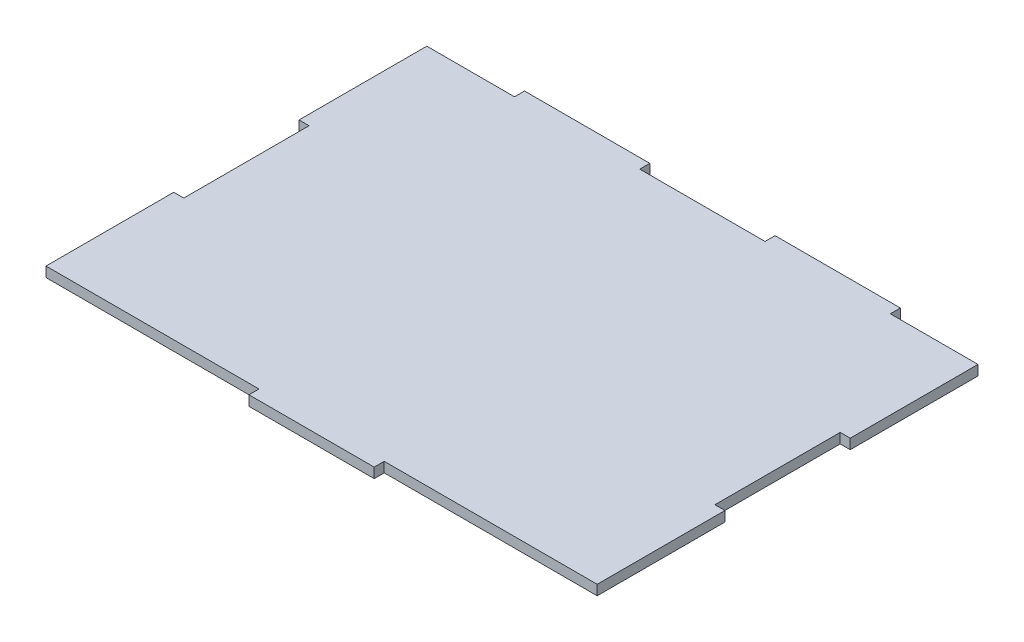
ISO-10303-21;
HEADER;
FILE_DESCRIPTION(('STEP AP214'),'2;1');
FILE_NAME('part.step','',(''),(''),'','','');
FILE_SCHEMA(('AUTOMOTIVE_DESIGN { 1 0 10303 214 1 1 1 1 }'));
ENDSEC;
DATA;
#1=APPLICATION_CONTEXT('core data for automotive mechanical design processes');
#2=APPLICATION_PROTOCOL_DEFINITION('international standard','automotive_design',2000,#1);
#3=PRODUCT_CONTEXT('',#1,'mechanical');
#4=PRODUCT('Part','Part','',(#3));
#5=PRODUCT_RELATED_PRODUCT_CATEGORY('part','',(#4));
#6=PRODUCT_DEFINITION_FORMATION('','',#4);
#7=PRODUCT_DEFINITION_CONTEXT('part definition',#1,'design');
#8=PRODUCT_DEFINITION('design','',#6,#7);
#9=PRODUCT_DEFINITION_SHAPE('','',#8);
#10=(LENGTH_UNIT() NAMED_UNIT(*) SI_UNIT(.MILLI.,.METRE.));
#11=(NAMED_UNIT(*) PLANE_ANGLE_UNIT() SI_UNIT($,.RADIAN.));
#12=(NAMED_UNIT(*) SI_UNIT($,.STERADIAN.) SOLID_ANGLE_UNIT());
#13=UNCERTAINTY_MEASURE_WITH_UNIT(LENGTH_MEASURE(1.E-05),#10,'distance_accuracy_value','');
#14=(GEOMETRIC_REPRESENTATION_CONTEXT(3) GLOBAL_UNCERTAINTY_ASSIGNED_CONTEXT((#13)) GLOBAL_UNIT_ASSIGNED_CONTEXT((#10,
#11,#12)) REPRESENTATION_CONTEXT('',''));
#15=CARTESIAN_POINT('',(0.,0.,0.));
#16=DIRECTION('',(0.,0.,1.));
#17=DIRECTION('',(1.,0.,0.));
#18=AXIS2_PLACEMENT_3D('',#15,#16,#17);
#19=CARTESIAN_POINT('',(-110.,4.,-76.));
#20=DIRECTION('',(0.,0.,1.));
#21=DIRECTION('',(1.,0.,0.));
#22=AXIS2_PLACEMENT_3D('',#19,#20,#21);
#23=PLANE('',#22);
#24=DIRECTION('',(-1.,0.,0.));
#25=VECTOR('',#24,1.);
#26=CARTESIAN_POINT('',(-110.,0.,-76.));
#27=LINE('',#26,#25);
#28=CARTESIAN_POINT('',(-75.,0.,-76.));
#29=VERTEX_POINT('',#28);
#30=CARTESIAN_POINT('',(-110.,0.,-76.));
#31=VERTEX_POINT('',#30);
#32=EDGE_CURVE('E242',#29,#31,#27,.T.);
#33=ORIENTED_EDGE('',*,*,#32,.T.);
#34=DIRECTION('',(0.,-1.,0.));
#35=VECTOR('',#34,1.);
#36=CARTESIAN_POINT('',(-110.,4.,-76.));
#37=LINE('',#36,#35);
#38=CARTESIAN_POINT('',(-110.,4.,-76.));
#39=VERTEX_POINT('',#38);
#40=EDGE_CURVE('E11',#39,#31,#37,.T.);
#41=ORIENTED_EDGE('',*,*,#40,.F.);
#42=DIRECTION('',(-1.,0.,0.));
#43=VECTOR('',#42,1.);
#44=CARTESIAN_POINT('',(-110.,4.,-76.));
#45=LINE('',#44,#43);
#46=CARTESIAN_POINT('',(-75.,4.,-76.));
#47=VERTEX_POINT('',#46);
#48=EDGE_CURVE('E312',#47,#39,#45,.T.);
#49=ORIENTED_EDGE('',*,*,#48,.F.);
#50=DIRECTION('',(0.,-1.,0.));
#51=VECTOR('',#50,1.);
#52=CARTESIAN_POINT('',(-75.,4.,-76.));
#53=LINE('',#52,#51);
#54=EDGE_CURVE('E238',#47,#29,#53,.T.);
#55=ORIENTED_EDGE('',*,*,#54,.T.);
#56=EDGE_LOOP('',(#33,#41,#49,#55));
#57=FACE_BOUND('',#56,.T.);
#58=ADVANCED_FACE('F45',(#57),#23,.F.);
#59=CARTESIAN_POINT('',(-110.,4.,-76.));
#60=DIRECTION('',(1.,0.,0.));
#61=DIRECTION('',(0.,0.,-1.));
#62=AXIS2_PLACEMENT_3D('',#59,#60,#61);
#63=PLANE('',#62);
#64=DIRECTION('',(0.,0.,1.));
#65=VECTOR('',#64,1.);
#66=CARTESIAN_POINT('',(-110.,0.,-76.));
#67=LINE('',#66,#65);
#68=CARTESIAN_POINT('',(-110.,0.,-25.));
#69=VERTEX_POINT('',#68);
#70=EDGE_CURVE('E246',#31,#69,#67,.T.);
#71=ORIENTED_EDGE('',*,*,#70,.T.);
#72=DIRECTION('',(0.,-1.,0.));
#73=VECTOR('',#72,1.);
#74=CARTESIAN_POINT('',(-110.,4.,-25.));
#75=LINE('',#74,#73);
#76=CARTESIAN_POINT('',(-110.,4.,-25.));
#77=VERTEX_POINT('',#76);
#78=EDGE_CURVE('E54',#77,#69,#75,.T.);
#79=ORIENTED_EDGE('',*,*,#78,.F.);
#80=DIRECTION('',(0.,0.,1.));
#81=VECTOR('',#80,1.);
#82=CARTESIAN_POINT('',(-110.,4.,-76.));
#83=LINE('',#82,#81);
#84=EDGE_CURVE('E153',#39,#77,#83,.T.);
#85=ORIENTED_EDGE('',*,*,#84,.F.);
#86=ORIENTED_EDGE('',*,*,#40,.T.);
#87=EDGE_LOOP('',(#71,#79,#85,#86));
#88=FACE_BOUND('',#87,.T.);
#89=ADVANCED_FACE('F490',(#88),#63,.F.);
#90=CARTESIAN_POINT('',(-106.,4.,-25.));
#91=DIRECTION('',(0.,0.,-1.));
#92=DIRECTION('',(-1.,0.,0.));
#93=AXIS2_PLACEMENT_3D('',#90,#91,#92);
#94=PLANE('',#93);
#95=DIRECTION('',(1.,0.,0.));
#96=VECTOR('',#95,1.);
#97=CARTESIAN_POINT('',(-106.,0.,-25.));
#98=LINE('',#97,#96);
#99=CARTESIAN_POINT('',(-106.,0.,-25.));
#100=VERTEX_POINT('',#99);
#101=EDGE_CURVE('E249',#69,#100,#98,.T.);
#102=ORIENTED_EDGE('',*,*,#101,.T.);
#103=DIRECTION('',(0.,-1.,0.));
#104=VECTOR('',#103,1.);
#105=CARTESIAN_POINT('',(-106.,4.,-25.));
#106=LINE('',#105,#104);
#107=CARTESIAN_POINT('',(-106.,4.,-25.));
#108=VERTEX_POINT('',#107);
#109=EDGE_CURVE('E387',#108,#100,#106,.T.);
#110=ORIENTED_EDGE('',*,*,#109,.F.);
#111=DIRECTION('',(1.,0.,0.));
#112=VECTOR('',#111,1.);
#113=CARTESIAN_POINT('',(-106.,4.,-25.));
#114=LINE('',#113,#112);
#115=EDGE_CURVE('E397',#77,#108,#114,.T.);
#116=ORIENTED_EDGE('',*,*,#115,.F.);
#117=ORIENTED_EDGE('',*,*,#78,.T.);
#118=EDGE_LOOP('',(#102,#110,#116,#117));
#119=FACE_BOUND('',#118,.T.);
#120=ADVANCED_FACE('F395',(#119),#94,.F.);
#121=CARTESIAN_POINT('',(-106.,4.,25.));
#122=DIRECTION('',(1.,0.,0.));
#123=DIRECTION('',(0.,0.,-1.));
#124=AXIS2_PLACEMENT_3D('',#121,#122,#123);
#125=PLANE('',#124);
#126=DIRECTION('',(0.,0.,1.));
#127=VECTOR('',#126,1.);
#128=CARTESIAN_POINT('',(-106.,0.,25.));
#129=LINE('',#128,#127);
#130=CARTESIAN_POINT('',(-106.,0.,25.));
#131=VERTEX_POINT('',#130);
#132=EDGE_CURVE('E252',#100,#131,#129,.T.);
#133=ORIENTED_EDGE('',*,*,#132,.T.);
#134=DIRECTION('',(0.,-1.,0.));
#135=VECTOR('',#134,1.);
#136=CARTESIAN_POINT('',(-106.,4.,25.));
#137=LINE('',#136,#135);
#138=CARTESIAN_POINT('',(-106.,4.,25.));
#139=VERTEX_POINT('',#138);
#140=EDGE_CURVE('E383',#139,#131,#137,.T.);
#141=ORIENTED_EDGE('',*,*,#140,.F.);
#142=DIRECTION('',(0.,0.,1.));
#143=VECTOR('',#142,1.);
#144=CARTESIAN_POINT('',(-106.,4.,25.));
#145=LINE('',#144,#143);
#146=EDGE_CURVE('E416',#108,#139,#145,.T.);
#147=ORIENTED_EDGE('',*,*,#146,.F.);
#148=ORIENTED_EDGE('',*,*,#109,.T.);
#149=EDGE_LOOP('',(#133,#141,#147,#148));
#150=FACE_BOUND('',#149,.T.);
#151=ADVANCED_FACE('F406',(#150),#125,.F.);
#152=CARTESIAN_POINT('',(-106.,4.,25.));
#153=DIRECTION('',(0.,0.,1.));
#154=DIRECTION('',(1.,0.,0.));
#155=AXIS2_PLACEMENT_3D('',#152,#153,#154);
#156=PLANE('',#155);
#157=DIRECTION('',(-1.,0.,0.));
#158=VECTOR('',#157,1.);
#159=CARTESIAN_POINT('',(-106.,0.,25.));
#160=LINE('',#159,#158);
#161=CARTESIAN_POINT('',(-110.,0.,25.));
#162=VERTEX_POINT('',#161);
#163=EDGE_CURVE('E255',#131,#162,#160,.T.);
#164=ORIENTED_EDGE('',*,*,#163,.T.);
#165=DIRECTION('',(0.,-1.,0.));
#166=VECTOR('',#165,1.);
#167=CARTESIAN_POINT('',(-110.,4.,25.));
#168=LINE('',#167,#166);
#169=CARTESIAN_POINT('',(-110.,4.,25.));
#170=VERTEX_POINT('',#169);
#171=EDGE_CURVE('E379',#170,#162,#168,.T.);
#172=ORIENTED_EDGE('',*,*,#171,.F.);
#173=DIRECTION('',(-1.,0.,0.));
#174=VECTOR('',#173,1.);
#175=CARTESIAN_POINT('',(-106.,4.,25.));
#176=LINE('',#175,#174);
#177=EDGE_CURVE('E412',#139,#170,#176,.T.);
#178=ORIENTED_EDGE('',*,*,#177,.F.);
#179=ORIENTED_EDGE('',*,*,#140,.T.);
#180=EDGE_LOOP('',(#164,#172,#178,#179));
#181=FACE_BOUND('',#180,.T.);
#182=ADVANCED_FACE('F410',(#181),#156,.F.);
#183=CARTESIAN_POINT('',(-110.,4.,25.));
#184=DIRECTION('',(1.,0.,0.));
#185=DIRECTION('',(0.,0.,-1.));
#186=AXIS2_PLACEMENT_3D('',#183,#184,#185);
#187=PLANE('',#186);
#188=DIRECTION('',(0.,0.,1.));
#189=VECTOR('',#188,1.);
#190=CARTESIAN_POINT('',(-110.,0.,25.));
#191=LINE('',#190,#189);
#192=CARTESIAN_POINT('',(-110.,0.,76.));
#193=VERTEX_POINT('',#192);
#194=EDGE_CURVE('E258',#162,#193,#191,.T.);
#195=ORIENTED_EDGE('',*,*,#194,.T.);
#196=DIRECTION('',(0.,-1.,0.));
#197=VECTOR('',#196,1.);
#198=CARTESIAN_POINT('',(-110.,4.,76.));
#199=LINE('',#198,#197);
#200=CARTESIAN_POINT('',(-110.,4.,76.));
#201=VERTEX_POINT('',#200);
#202=EDGE_CURVE('E375',#201,#193,#199,.T.);
#203=ORIENTED_EDGE('',*,*,#202,.F.);
#204=DIRECTION('',(0.,0.,1.));
#205=VECTOR('',#204,1.);
#206=CARTESIAN_POINT('',(-110.,4.,25.));
#207=LINE('',#206,#205);
#208=EDGE_CURVE('E415',#170,#201,#207,.T.);
#209=ORIENTED_EDGE('',*,*,#208,.F.);
#210=ORIENTED_EDGE('',*,*,#171,.T.);
#211=EDGE_LOOP('',(#195,#203,#209,#210));
#212=FACE_BOUND('',#211,.T.);
#213=ADVANCED_FACE('F503',(#212),#187,.F.);
#214=CARTESIAN_POINT('',(-110.,4.,76.));
#215=DIRECTION('',(0.,0.,-1.));
#216=DIRECTION('',(-1.,0.,0.));
#217=AXIS2_PLACEMENT_3D('',#214,#215,#216);
#218=PLANE('',#217);
#219=DIRECTION('',(1.,0.,0.));
#220=VECTOR('',#219,1.);
#221=CARTESIAN_POINT('',(-110.,0.,76.));
#222=LINE('',#221,#220);
#223=CARTESIAN_POINT('',(-25.,0.,76.));
#224=VERTEX_POINT('',#223);
#225=EDGE_CURVE('E261',#193,#224,#222,.T.);
#226=ORIENTED_EDGE('',*,*,#225,.T.);
#227=DIRECTION('',(0.,-1.,0.));
#228=VECTOR('',#227,1.);
#229=CARTESIAN_POINT('',(-25.,4.,76.));
#230=LINE('',#229,#228);
#231=CARTESIAN_POINT('',(-25.,4.,76.));
#232=VERTEX_POINT('',#231);
#233=EDGE_CURVE('E371',#232,#224,#230,.T.);
#234=ORIENTED_EDGE('',*,*,#233,.F.);
#235=DIRECTION('',(1.,0.,0.));
#236=VECTOR('',#235,1.);
#237=CARTESIAN_POINT('',(-110.,4.,76.));
#238=LINE('',#237,#236);
#239=EDGE_CURVE('E420',#201,#232,#238,.T.);
#240=ORIENTED_EDGE('',*,*,#239,.F.);
#241=ORIENTED_EDGE('',*,*,#202,.T.);
#242=EDGE_LOOP('',(#226,#234,#240,#241));
#243=FACE_BOUND('',#242,.T.);
#244=ADVANCED_FACE('F506',(#243),#218,.F.);
#245=CARTESIAN_POINT('',(-25.,4.,76.));
#246=DIRECTION('',(1.,0.,0.));
#247=DIRECTION('',(0.,0.,-1.));
#248=AXIS2_PLACEMENT_3D('',#245,#246,#247);
#249=PLANE('',#248);
#250=DIRECTION('',(0.,0.,1.));
#251=VECTOR('',#250,1.);
#252=CARTESIAN_POINT('',(-25.,0.,76.));
#253=LINE('',#252,#251);
#254=CARTESIAN_POINT('',(-25.,0.,80.));
#255=VERTEX_POINT('',#254);
#256=EDGE_CURVE('E264',#224,#255,#253,.T.);
#257=ORIENTED_EDGE('',*,*,#256,.T.);
#258=DIRECTION('',(0.,-1.,0.));
#259=VECTOR('',#258,1.);
#260=CARTESIAN_POINT('',(-25.,4.,80.));
#261=LINE('',#260,#259);
#262=CARTESIAN_POINT('',(-25.,4.,80.));
#263=VERTEX_POINT('',#262);
#264=EDGE_CURVE('E367',#263,#255,#261,.T.);
#265=ORIENTED_EDGE('',*,*,#264,.F.);
#266=DIRECTION('',(0.,0.,1.));
#267=VECTOR('',#266,1.);
#268=CARTESIAN_POINT('',(-25.,4.,76.));
#269=LINE('',#268,#267);
#270=EDGE_CURVE('E427',#232,#263,#269,.T.);
#271=ORIENTED_EDGE('',*,*,#270,.F.);
#272=ORIENTED_EDGE('',*,*,#233,.T.);
#273=EDGE_LOOP('',(#257,#265,#271,#272));
#274=FACE_BOUND('',#273,.T.);
#275=ADVANCED_FACE('F510',(#274),#249,.F.);
#276=CARTESIAN_POINT('',(-25.,4.,80.));
#277=DIRECTION('',(0.,0.,-1.));
#278=DIRECTION('',(-1.,0.,0.));
#279=AXIS2_PLACEMENT_3D('',#276,#277,#278);
#280=PLANE('',#279);
#281=DIRECTION('',(1.,0.,0.));
#282=VECTOR('',#281,1.);
#283=CARTESIAN_POINT('',(-25.,0.,80.));
#284=LINE('',#283,#282);
#285=CARTESIAN_POINT('',(25.,0.,80.));
#286=VERTEX_POINT('',#285);
#287=EDGE_CURVE('E267',#255,#286,#284,.T.);
#288=ORIENTED_EDGE('',*,*,#287,.T.);
#289=DIRECTION('',(0.,-1.,0.));
#290=VECTOR('',#289,1.);
#291=CARTESIAN_POINT('',(25.,4.,80.));
#292=LINE('',#291,#290);
#293=CARTESIAN_POINT('',(25.,4.,80.));
#294=VERTEX_POINT('',#293);
#295=EDGE_CURVE('E363',#294,#286,#292,.T.);
#296=ORIENTED_EDGE('',*,*,#295,.F.);
#297=DIRECTION('',(1.,0.,0.));
#298=VECTOR('',#297,1.);
#299=CARTESIAN_POINT('',(-25.,4.,80.));
#300=LINE('',#299,#298);
#301=EDGE_CURVE('E430',#263,#294,#300,.T.);
#302=ORIENTED_EDGE('',*,*,#301,.F.);
#303=ORIENTED_EDGE('',*,*,#264,.T.);
#304=EDGE_LOOP('',(#288,#296,#302,#303));
#305=FACE_BOUND('',#304,.T.);
#306=ADVANCED_FACE('F514',(#305),#280,.F.);
#307=CARTESIAN_POINT('',(25.,4.,76.));
#308=DIRECTION('',(-1.,0.,0.));
#309=DIRECTION('',(0.,0.,1.));
#310=AXIS2_PLACEMENT_3D('',#307,#308,#309);
#311=PLANE('',#310);
#312=DIRECTION('',(0.,0.,-1.));
#313=VECTOR('',#312,1.);
#314=CARTESIAN_POINT('',(25.,0.,76.));
#315=LINE('',#314,#313);
#316=CARTESIAN_POINT('',(25.,0.,76.));
#317=VERTEX_POINT('',#316);
#318=EDGE_CURVE('E270',#286,#317,#315,.T.);
#319=ORIENTED_EDGE('',*,*,#318,.T.);
#320=DIRECTION('',(0.,-1.,0.));
#321=VECTOR('',#320,1.);
#322=CARTESIAN_POINT('',(25.,4.,76.));
#323=LINE('',#322,#321);
#324=CARTESIAN_POINT('',(25.,4.,76.));
#325=VERTEX_POINT('',#324);
#326=EDGE_CURVE('E359',#325,#317,#323,.T.);
#327=ORIENTED_EDGE('',*,*,#326,.F.);
#328=DIRECTION('',(0.,0.,-1.));
#329=VECTOR('',#328,1.);
#330=CARTESIAN_POINT('',(25.,4.,76.));
#331=LINE('',#330,#329);
#332=EDGE_CURVE('E433',#294,#325,#331,.T.);
#333=ORIENTED_EDGE('',*,*,#332,.F.);
#334=ORIENTED_EDGE('',*,*,#295,.T.);
#335=EDGE_LOOP('',(#319,#327,#333,#334));
#336=FACE_BOUND('',#335,.T.);
#337=ADVANCED_FACE('F518',(#336),#311,.F.);
#338=CARTESIAN_POINT('',(25.,4.,76.));
#339=DIRECTION('',(0.,0.,-1.));
#340=DIRECTION('',(-1.,0.,0.));
#341=AXIS2_PLACEMENT_3D('',#338,#339,#340);
#342=PLANE('',#341);
#343=DIRECTION('',(1.,0.,0.));
#344=VECTOR('',#343,1.);
#345=CARTESIAN_POINT('',(25.,0.,76.));
#346=LINE('',#345,#344);
#347=CARTESIAN_POINT('',(110.,0.,76.));
#348=VERTEX_POINT('',#347);
#349=EDGE_CURVE('E273',#317,#348,#346,.T.);
#350=ORIENTED_EDGE('',*,*,#349,.T.);
#351=DIRECTION('',(0.,-1.,0.));
#352=VECTOR('',#351,1.);
#353=CARTESIAN_POINT('',(110.,4.,76.));
#354=LINE('',#353,#352);
#355=CARTESIAN_POINT('',(110.,4.,76.));
#356=VERTEX_POINT('',#355);
#357=EDGE_CURVE('E355',#356,#348,#354,.T.);
#358=ORIENTED_EDGE('',*,*,#357,.F.);
#359=DIRECTION('',(1.,0.,0.));
#360=VECTOR('',#359,1.);
#361=CARTESIAN_POINT('',(25.,4.,76.));
#362=LINE('',#361,#360);
#363=EDGE_CURVE('E436',#325,#356,#362,.T.);
#364=ORIENTED_EDGE('',*,*,#363,.F.);
#365=ORIENTED_EDGE('',*,*,#326,.T.);
#366=EDGE_LOOP('',(#350,#358,#364,#365));
#367=FACE_BOUND('',#366,.T.);
#368=ADVANCED_FACE('F522',(#367),#342,.F.);
#369=CARTESIAN_POINT('',(110.,4.,76.));
#370=DIRECTION('',(-1.,0.,0.));
#371=DIRECTION('',(0.,0.,1.));
#372=AXIS2_PLACEMENT_3D('',#369,#370,#371);
#373=PLANE('',#372);
#374=DIRECTION('',(0.,0.,-1.));
#375=VECTOR('',#374,1.);
#376=CARTESIAN_POINT('',(110.,0.,76.));
#377=LINE('',#376,#375);
#378=CARTESIAN_POINT('',(110.,0.,25.));
#379=VERTEX_POINT('',#378);
#380=EDGE_CURVE('E276',#348,#379,#377,.T.);
#381=ORIENTED_EDGE('',*,*,#380,.T.);
#382=DIRECTION('',(0.,-1.,0.));
#383=VECTOR('',#382,1.);
#384=CARTESIAN_POINT('',(110.,4.,25.));
#385=LINE('',#384,#383);
#386=CARTESIAN_POINT('',(110.,4.,25.));
#387=VERTEX_POINT('',#386);
#388=EDGE_CURVE('E351',#387,#379,#385,.T.);
#389=ORIENTED_EDGE('',*,*,#388,.F.);
#390=DIRECTION('',(0.,0.,-1.));
#391=VECTOR('',#390,1.);
#392=CARTESIAN_POINT('',(110.,4.,76.));
#393=LINE('',#392,#391);
#394=EDGE_CURVE('E439',#356,#387,#393,.T.);
#395=ORIENTED_EDGE('',*,*,#394,.F.);
#396=ORIENTED_EDGE('',*,*,#357,.T.);
#397=EDGE_LOOP('',(#381,#389,#395,#396));
#398=FACE_BOUND('',#397,.T.);
#399=ADVANCED_FACE('F526',(#398),#373,.F.);
#400=CARTESIAN_POINT('',(106.,4.,25.));
#401=DIRECTION('',(0.,0.,1.));
#402=DIRECTION('',(1.,0.,0.));
#403=AXIS2_PLACEMENT_3D('',#400,#401,#402);
#404=PLANE('',#403);
#405=DIRECTION('',(-1.,0.,0.));
#406=VECTOR('',#405,1.);
#407=CARTESIAN_POINT('',(106.,0.,25.));
#408=LINE('',#407,#406);
#409=CARTESIAN_POINT('',(106.,0.,25.));
#410=VERTEX_POINT('',#409);
#411=EDGE_CURVE('E279',#379,#410,#408,.T.);
#412=ORIENTED_EDGE('',*,*,#411,.T.);
#413=DIRECTION('',(0.,-1.,0.));
#414=VECTOR('',#413,1.);
#415=CARTESIAN_POINT('',(106.,4.,25.));
#416=LINE('',#415,#414);
#417=CARTESIAN_POINT('',(106.,4.,25.));
#418=VERTEX_POINT('',#417);
#419=EDGE_CURVE('E347',#418,#410,#416,.T.);
#420=ORIENTED_EDGE('',*,*,#419,.F.);
#421=DIRECTION('',(-1.,0.,0.));
#422=VECTOR('',#421,1.);
#423=CARTESIAN_POINT('',(106.,4.,25.));
#424=LINE('',#423,#422);
#425=EDGE_CURVE('E442',#387,#418,#424,.T.);
#426=ORIENTED_EDGE('',*,*,#425,.F.);
#427=ORIENTED_EDGE('',*,*,#388,.T.);
#428=EDGE_LOOP('',(#412,#420,#426,#427));
#429=FACE_BOUND('',#428,.T.);
#430=ADVANCED_FACE('F530',(#429),#404,.F.);
#431=CARTESIAN_POINT('',(106.,4.,25.));
#432=DIRECTION('',(-1.,0.,0.));
#433=DIRECTION('',(0.,0.,1.));
#434=AXIS2_PLACEMENT_3D('',#431,#432,#433);
#435=PLANE('',#434);
#436=DIRECTION('',(0.,0.,-1.));
#437=VECTOR('',#436,1.);
#438=CARTESIAN_POINT('',(106.,0.,25.));
#439=LINE('',#438,#437);
#440=CARTESIAN_POINT('',(106.,0.,-25.));
#441=VERTEX_POINT('',#440);
#442=EDGE_CURVE('E282',#410,#441,#439,.T.);
#443=ORIENTED_EDGE('',*,*,#442,.T.);
#444=DIRECTION('',(0.,-1.,0.));
#445=VECTOR('',#444,1.);
#446=CARTESIAN_POINT('',(106.,4.,-25.));
#447=LINE('',#446,#445);
#448=CARTESIAN_POINT('',(106.,4.,-25.));
#449=VERTEX_POINT('',#448);
#450=EDGE_CURVE('E343',#449,#441,#447,.T.);
#451=ORIENTED_EDGE('',*,*,#450,.F.);
#452=DIRECTION('',(0.,0.,-1.));
#453=VECTOR('',#452,1.);
#454=CARTESIAN_POINT('',(106.,4.,25.));
#455=LINE('',#454,#453);
#456=EDGE_CURVE('E445',#418,#449,#455,.T.);
#457=ORIENTED_EDGE('',*,*,#456,.F.);
#458=ORIENTED_EDGE('',*,*,#419,.T.);
#459=EDGE_LOOP('',(#443,#451,#457,#458));
#460=FACE_BOUND('',#459,.T.);
#461=ADVANCED_FACE('F534',(#460),#435,.F.);
#462=CARTESIAN_POINT('',(106.,4.,-25.));
#463=DIRECTION('',(0.,0.,-1.));
#464=DIRECTION('',(-1.,0.,0.));
#465=AXIS2_PLACEMENT_3D('',#462,#463,#464);
#466=PLANE('',#465);
#467=DIRECTION('',(1.,0.,0.));
#468=VECTOR('',#467,1.);
#469=CARTESIAN_POINT('',(106.,0.,-25.));
#470=LINE('',#469,#468);
#471=CARTESIAN_POINT('',(110.,0.,-25.));
#472=VERTEX_POINT('',#471);
#473=EDGE_CURVE('E285',#441,#472,#470,.T.);
#474=ORIENTED_EDGE('',*,*,#473,.T.);
#475=DIRECTION('',(0.,-1.,0.));
#476=VECTOR('',#475,1.);
#477=CARTESIAN_POINT('',(110.,4.,-25.));
#478=LINE('',#477,#476);
#479=CARTESIAN_POINT('',(110.,4.,-25.));
#480=VERTEX_POINT('',#479);
#481=EDGE_CURVE('E339',#480,#472,#478,.T.);
#482=ORIENTED_EDGE('',*,*,#481,.F.);
#483=DIRECTION('',(1.,0.,0.));
#484=VECTOR('',#483,1.);
#485=CARTESIAN_POINT('',(106.,4.,-25.));
#486=LINE('',#485,#484);
#487=EDGE_CURVE('E448',#449,#480,#486,.T.);
#488=ORIENTED_EDGE('',*,*,#487,.F.);
#489=ORIENTED_EDGE('',*,*,#450,.T.);
#490=EDGE_LOOP('',(#474,#482,#488,#489));
#491=FACE_BOUND('',#490,.T.);
#492=ADVANCED_FACE('F538',(#491),#466,.F.);
#493=CARTESIAN_POINT('',(110.,4.,-25.));
#494=DIRECTION('',(-1.,0.,0.));
#495=DIRECTION('',(0.,0.,1.));
#496=AXIS2_PLACEMENT_3D('',#493,#494,#495);
#497=PLANE('',#496);
#498=DIRECTION('',(0.,0.,-1.));
#499=VECTOR('',#498,1.);
#500=CARTESIAN_POINT('',(110.,0.,-25.));
#501=LINE('',#500,#499);
#502=CARTESIAN_POINT('',(110.,0.,-76.));
#503=VERTEX_POINT('',#502);
#504=EDGE_CURVE('E288',#472,#503,#501,.T.);
#505=ORIENTED_EDGE('',*,*,#504,.T.);
#506=DIRECTION('',(0.,-1.,0.));
#507=VECTOR('',#506,1.);
#508=CARTESIAN_POINT('',(110.,4.,-76.));
#509=LINE('',#508,#507);
#510=CARTESIAN_POINT('',(110.,4.,-76.));
#511=VERTEX_POINT('',#510);
#512=EDGE_CURVE('E335',#511,#503,#509,.T.);
#513=ORIENTED_EDGE('',*,*,#512,.F.);
#514=DIRECTION('',(0.,0.,-1.));
#515=VECTOR('',#514,1.);
#516=CARTESIAN_POINT('',(110.,4.,-25.));
#517=LINE('',#516,#515);
#518=EDGE_CURVE('E451',#480,#511,#517,.T.);
#519=ORIENTED_EDGE('',*,*,#518,.F.);
#520=ORIENTED_EDGE('',*,*,#481,.T.);
#521=EDGE_LOOP('',(#505,#513,#519,#520));
#522=FACE_BOUND('',#521,.T.);
#523=ADVANCED_FACE('F542',(#522),#497,.F.);
#524=CARTESIAN_POINT('',(75.,4.,-76.));
#525=DIRECTION('',(0.,0.,1.));
#526=DIRECTION('',(1.,0.,0.));
#527=AXIS2_PLACEMENT_3D('',#524,#525,#526);
#528=PLANE('',#527);
#529=DIRECTION('',(-1.,0.,0.));
#530=VECTOR('',#529,1.);
#531=CARTESIAN_POINT('',(75.,0.,-76.));
#532=LINE('',#531,#530);
#533=CARTESIAN_POINT('',(75.,0.,-76.));
#534=VERTEX_POINT('',#533);
#535=EDGE_CURVE('E291',#503,#534,#532,.T.);
#536=ORIENTED_EDGE('',*,*,#535,.T.);
#537=DIRECTION('',(0.,-1.,0.));
#538=VECTOR('',#537,1.);
#539=CARTESIAN_POINT('',(75.,4.,-76.));
#540=LINE('',#539,#538);
#541=CARTESIAN_POINT('',(75.,4.,-76.));
#542=VERTEX_POINT('',#541);
#543=EDGE_CURVE('E331',#542,#534,#540,.T.);
#544=ORIENTED_EDGE('',*,*,#543,.F.);
#545=DIRECTION('',(-1.,0.,0.));
#546=VECTOR('',#545,1.);
#547=CARTESIAN_POINT('',(75.,4.,-76.));
#548=LINE('',#547,#546);
#549=EDGE_CURVE('E454',#511,#542,#548,.T.);
#550=ORIENTED_EDGE('',*,*,#549,.F.);
#551=ORIENTED_EDGE('',*,*,#512,.T.);
#552=EDGE_LOOP('',(#536,#544,#550,#551));
#553=FACE_BOUND('',#552,.T.);
#554=ADVANCED_FACE('F546',(#553),#528,.F.);
#555=CARTESIAN_POINT('',(75.,4.,-80.));
#556=DIRECTION('',(-1.,0.,0.));
#557=DIRECTION('',(0.,0.,1.));
#558=AXIS2_PLACEMENT_3D('',#555,#556,#557);
#559=PLANE('',#558);
#560=DIRECTION('',(0.,0.,-1.));
#561=VECTOR('',#560,1.);
#562=CARTESIAN_POINT('',(75.,0.,-80.));
#563=LINE('',#562,#561);
#564=CARTESIAN_POINT('',(75.,0.,-80.));
#565=VERTEX_POINT('',#564);
#566=EDGE_CURVE('E294',#534,#565,#563,.T.);
#567=ORIENTED_EDGE('',*,*,#566,.T.);
#568=DIRECTION('',(0.,-1.,0.));
#569=VECTOR('',#568,1.);
#570=CARTESIAN_POINT('',(75.,4.,-80.));
#571=LINE('',#570,#569);
#572=CARTESIAN_POINT('',(75.,4.,-80.));
#573=VERTEX_POINT('',#572);
#574=EDGE_CURVE('E327',#573,#565,#571,.T.);
#575=ORIENTED_EDGE('',*,*,#574,.F.);
#576=DIRECTION('',(0.,0.,-1.));
#577=VECTOR('',#576,1.);
#578=CARTESIAN_POINT('',(75.,4.,-80.));
#579=LINE('',#578,#577);
#580=EDGE_CURVE('E457',#542,#573,#579,.T.);
#581=ORIENTED_EDGE('',*,*,#580,.F.);
#582=ORIENTED_EDGE('',*,*,#543,.T.);
#583=EDGE_LOOP('',(#567,#575,#581,#582));
#584=FACE_BOUND('',#583,.T.);
#585=ADVANCED_FACE('F550',(#584),#559,.F.);
#586=CARTESIAN_POINT('',(75.,4.,-80.));
#587=DIRECTION('',(0.,0.,1.));
#588=DIRECTION('',(1.,0.,0.));
#589=AXIS2_PLACEMENT_3D('',#586,#587,#588);
#590=PLANE('',#589);
#591=DIRECTION('',(-1.,0.,0.));
#592=VECTOR('',#591,1.);
#593=CARTESIAN_POINT('',(75.,0.,-80.));
#594=LINE('',#593,#592);
#595=CARTESIAN_POINT('',(25.,0.,-80.));
#596=VERTEX_POINT('',#595);
#597=EDGE_CURVE('E297',#565,#596,#594,.T.);
#598=ORIENTED_EDGE('',*,*,#597,.T.);
#599=DIRECTION('',(0.,-1.,0.));
#600=VECTOR('',#599,1.);
#601=CARTESIAN_POINT('',(25.,4.,-80.));
#602=LINE('',#601,#600);
#603=CARTESIAN_POINT('',(25.,4.,-80.));
#604=VERTEX_POINT('',#603);
#605=EDGE_CURVE('E323',#604,#596,#602,.T.);
#606=ORIENTED_EDGE('',*,*,#605,.F.);
#607=DIRECTION('',(-1.,0.,0.));
#608=VECTOR('',#607,1.);
#609=CARTESIAN_POINT('',(75.,4.,-80.));
#610=LINE('',#609,#608);
#611=EDGE_CURVE('E460',#573,#604,#610,.T.);
#612=ORIENTED_EDGE('',*,*,#611,.F.);
#613=ORIENTED_EDGE('',*,*,#574,.T.);
#614=EDGE_LOOP('',(#598,#606,#612,#613));
#615=FACE_BOUND('',#614,.T.);
#616=ADVANCED_FACE('F554',(#615),#590,.F.);
#617=CARTESIAN_POINT('',(25.,4.,-80.));
#618=DIRECTION('',(1.,0.,0.));
#619=DIRECTION('',(0.,0.,-1.));
#620=AXIS2_PLACEMENT_3D('',#617,#618,#619);
#621=PLANE('',#620);
#622=DIRECTION('',(0.,0.,1.));
#623=VECTOR('',#622,1.);
#624=CARTESIAN_POINT('',(25.,0.,-80.));
#625=LINE('',#624,#623);
#626=CARTESIAN_POINT('',(25.,0.,-76.));
#627=VERTEX_POINT('',#626);
#628=EDGE_CURVE('E300',#596,#627,#625,.T.);
#629=ORIENTED_EDGE('',*,*,#628,.T.);
#630=DIRECTION('',(0.,-1.,0.));
#631=VECTOR('',#630,1.);
#632=CARTESIAN_POINT('',(25.,4.,-76.));
#633=LINE('',#632,#631);
#634=CARTESIAN_POINT('',(25.,4.,-76.));
#635=VERTEX_POINT('',#634);
#636=EDGE_CURVE('E319',#635,#627,#633,.T.);
#637=ORIENTED_EDGE('',*,*,#636,.F.);
#638=DIRECTION('',(0.,0.,1.));
#639=VECTOR('',#638,1.);
#640=CARTESIAN_POINT('',(25.,4.,-80.));
#641=LINE('',#640,#639);
#642=EDGE_CURVE('E463',#604,#635,#641,.T.);
#643=ORIENTED_EDGE('',*,*,#642,.F.);
#644=ORIENTED_EDGE('',*,*,#605,.T.);
#645=EDGE_LOOP('',(#629,#637,#643,#644));
#646=FACE_BOUND('',#645,.T.);
#647=ADVANCED_FACE('F471',(#646),#621,.F.);
#648=CARTESIAN_POINT('',(-25.,4.,-76.));
#649=DIRECTION('',(0.,0.,1.));
#650=DIRECTION('',(1.,0.,0.));
#651=AXIS2_PLACEMENT_3D('',#648,#649,#650);
#652=PLANE('',#651);
#653=DIRECTION('',(-1.,0.,0.));
#654=VECTOR('',#653,1.);
#655=CARTESIAN_POINT('',(-25.,0.,-76.));
#656=LINE('',#655,#654);
#657=CARTESIAN_POINT('',(-25.,0.,-76.));
#658=VERTEX_POINT('',#657);
#659=EDGE_CURVE('E303',#627,#658,#656,.T.);
#660=ORIENTED_EDGE('',*,*,#659,.T.);
#661=DIRECTION('',(0.,-1.,0.));
#662=VECTOR('',#661,1.);
#663=CARTESIAN_POINT('',(-25.,4.,-76.));
#664=LINE('',#663,#662);
#665=CARTESIAN_POINT('',(-25.,4.,-76.));
#666=VERTEX_POINT('',#665);
#667=EDGE_CURVE('E231',#666,#658,#664,.T.);
#668=ORIENTED_EDGE('',*,*,#667,.F.);
#669=DIRECTION('',(-1.,0.,0.));
#670=VECTOR('',#669,1.);
#671=CARTESIAN_POINT('',(-25.,4.,-76.));
#672=LINE('',#671,#670);
#673=EDGE_CURVE('E220',#635,#666,#672,.T.);
#674=ORIENTED_EDGE('',*,*,#673,.F.);
#675=ORIENTED_EDGE('',*,*,#636,.T.);
#676=EDGE_LOOP('',(#660,#668,#674,#675));
#677=FACE_BOUND('',#676,.T.);
#678=ADVANCED_FACE('F475',(#677),#652,.F.);
#679=CARTESIAN_POINT('',(-25.,4.,-76.));
#680=DIRECTION('',(-1.,0.,0.));
#681=DIRECTION('',(0.,0.,1.));
#682=AXIS2_PLACEMENT_3D('',#679,#680,#681);
#683=PLANE('',#682);
#684=DIRECTION('',(0.,0.,-1.));
#685=VECTOR('',#684,1.);
#686=CARTESIAN_POINT('',(-25.,0.,-76.));
#687=LINE('',#686,#685);
#688=CARTESIAN_POINT('',(-25.,0.,-80.));
#689=VERTEX_POINT('',#688);
#690=EDGE_CURVE('E229',#658,#689,#687,.T.);
#691=ORIENTED_EDGE('',*,*,#690,.T.);
#692=DIRECTION('',(0.,-1.,0.));
#693=VECTOR('',#692,1.);
#694=CARTESIAN_POINT('',(-25.,4.,-80.));
#695=LINE('',#694,#693);
#696=CARTESIAN_POINT('',(-25.,4.,-80.));
#697=VERTEX_POINT('',#696);
#698=EDGE_CURVE('E226',#697,#689,#695,.T.);
#699=ORIENTED_EDGE('',*,*,#698,.F.);
#700=DIRECTION('',(0.,0.,-1.));
#701=VECTOR('',#700,1.);
#702=CARTESIAN_POINT('',(-25.,4.,-76.));
#703=LINE('',#702,#701);
#704=EDGE_CURVE('E214',#666,#697,#703,.T.);
#705=ORIENTED_EDGE('',*,*,#704,.F.);
#706=ORIENTED_EDGE('',*,*,#667,.T.);
#707=EDGE_LOOP('',(#691,#699,#705,#706));
#708=FACE_BOUND('',#707,.T.);
#709=ADVANCED_FACE('F227',(#708),#683,.F.);
#710=CARTESIAN_POINT('',(-25.,4.,-80.));
#711=DIRECTION('',(0.,0.,1.));
#712=DIRECTION('',(1.,0.,0.));
#713=AXIS2_PLACEMENT_3D('',#710,#711,#712);
#714=PLANE('',#713);
#715=DIRECTION('',(-1.,0.,0.));
#716=VECTOR('',#715,1.);
#717=CARTESIAN_POINT('',(-25.,0.,-80.));
#718=LINE('',#717,#716);
#719=CARTESIAN_POINT('',(-75.,0.,-80.));
#720=VERTEX_POINT('',#719);
#721=EDGE_CURVE('E139',#689,#720,#718,.T.);
#722=ORIENTED_EDGE('',*,*,#721,.T.);
#723=DIRECTION('',(0.,-1.,0.));
#724=VECTOR('',#723,1.);
#725=CARTESIAN_POINT('',(-75.,4.,-80.));
#726=LINE('',#725,#724);
#727=CARTESIAN_POINT('',(-75.,4.,-80.));
#728=VERTEX_POINT('',#727);
#729=EDGE_CURVE('E232',#728,#720,#726,.T.);
#730=ORIENTED_EDGE('',*,*,#729,.F.);
#731=DIRECTION('',(-1.,0.,0.));
#732=VECTOR('',#731,1.);
#733=CARTESIAN_POINT('',(-25.,4.,-80.));
#734=LINE('',#733,#732);
#735=EDGE_CURVE('E218',#697,#728,#734,.T.);
#736=ORIENTED_EDGE('',*,*,#735,.F.);
#737=ORIENTED_EDGE('',*,*,#698,.T.);
#738=EDGE_LOOP('',(#722,#730,#736,#737));
#739=FACE_BOUND('',#738,.T.);
#740=ADVANCED_FACE('F234',(#739),#714,.F.);
#741=CARTESIAN_POINT('',(-75.,4.,-80.));
#742=DIRECTION('',(1.,0.,0.));
#743=DIRECTION('',(0.,0.,-1.));
#744=AXIS2_PLACEMENT_3D('',#741,#742,#743);
#745=PLANE('',#744);
#746=DIRECTION('',(0.,0.,1.));
#747=VECTOR('',#746,1.);
#748=CARTESIAN_POINT('',(-75.,0.,-80.));
#749=LINE('',#748,#747);
#750=EDGE_CURVE('E145',#720,#29,#749,.T.);
#751=ORIENTED_EDGE('',*,*,#750,.T.);
#752=ORIENTED_EDGE('',*,*,#54,.F.);
#753=DIRECTION('',(0.,0.,1.));
#754=VECTOR('',#753,1.);
#755=CARTESIAN_POINT('',(-75.,4.,-80.));
#756=LINE('',#755,#754);
#757=EDGE_CURVE('E62',#728,#47,#756,.T.);
#758=ORIENTED_EDGE('',*,*,#757,.F.);
#759=ORIENTED_EDGE('',*,*,#729,.T.);
#760=EDGE_LOOP('',(#751,#752,#758,#759));
#761=FACE_BOUND('',#760,.T.);
#762=ADVANCED_FACE('F479',(#761),#745,.F.);
#763=CARTESIAN_POINT('',(0.,4.,0.));
#764=DIRECTION('',(0.,-1.,0.));
#765=DIRECTION('',(0.,0.,-1.));
#766=AXIS2_PLACEMENT_3D('',#763,#764,#765);
#767=PLANE('',#766);
#768=ORIENTED_EDGE('',*,*,#48,.T.);
#769=ORIENTED_EDGE('',*,*,#84,.T.);
#770=ORIENTED_EDGE('',*,*,#115,.T.);
#771=ORIENTED_EDGE('',*,*,#146,.T.);
#772=ORIENTED_EDGE('',*,*,#177,.T.);
#773=ORIENTED_EDGE('',*,*,#208,.T.);
#774=ORIENTED_EDGE('',*,*,#239,.T.);
#775=ORIENTED_EDGE('',*,*,#270,.T.);
#776=ORIENTED_EDGE('',*,*,#301,.T.);
#777=ORIENTED_EDGE('',*,*,#332,.T.);
#778=ORIENTED_EDGE('',*,*,#363,.T.);
#779=ORIENTED_EDGE('',*,*,#394,.T.);
#780=ORIENTED_EDGE('',*,*,#425,.T.);
#781=ORIENTED_EDGE('',*,*,#456,.T.);
#782=ORIENTED_EDGE('',*,*,#487,.T.);
#783=ORIENTED_EDGE('',*,*,#518,.T.);
#784=ORIENTED_EDGE('',*,*,#549,.T.);
#785=ORIENTED_EDGE('',*,*,#580,.T.);
#786=ORIENTED_EDGE('',*,*,#611,.T.);
#787=ORIENTED_EDGE('',*,*,#642,.T.);
#788=ORIENTED_EDGE('',*,*,#673,.T.);
#789=ORIENTED_EDGE('',*,*,#704,.T.);
#790=ORIENTED_EDGE('',*,*,#735,.T.);
#791=ORIENTED_EDGE('',*,*,#757,.T.);
#792=EDGE_LOOP('',(#768,#769,#770,#771,#772,#773,#774,#775,#776,#777,#778,#779,#780,#781,#782,
#783,#784,#785,#786,#787,#788,#789,#790,#791));
#793=FACE_BOUND('',#792,.T.);
#794=ADVANCED_FACE('F216',(#793),#767,.F.);
#795=CARTESIAN_POINT('',(0.,0.,0.));
#796=DIRECTION('',(0.,-1.,0.));
#797=DIRECTION('',(0.,0.,-1.));
#798=AXIS2_PLACEMENT_3D('',#795,#796,#797);
#799=PLANE('',#798);
#800=ORIENTED_EDGE('',*,*,#32,.F.);
#801=ORIENTED_EDGE('',*,*,#750,.F.);
#802=ORIENTED_EDGE('',*,*,#721,.F.);
#803=ORIENTED_EDGE('',*,*,#690,.F.);
#804=ORIENTED_EDGE('',*,*,#659,.F.);
#805=ORIENTED_EDGE('',*,*,#628,.F.);
#806=ORIENTED_EDGE('',*,*,#597,.F.);
#807=ORIENTED_EDGE('',*,*,#566,.F.);
#808=ORIENTED_EDGE('',*,*,#535,.F.);
#809=ORIENTED_EDGE('',*,*,#504,.F.);
#810=ORIENTED_EDGE('',*,*,#473,.F.);
#811=ORIENTED_EDGE('',*,*,#442,.F.);
#812=ORIENTED_EDGE('',*,*,#411,.F.);
#813=ORIENTED_EDGE('',*,*,#380,.F.);
#814=ORIENTED_EDGE('',*,*,#349,.F.);
#815=ORIENTED_EDGE('',*,*,#318,.F.);
#816=ORIENTED_EDGE('',*,*,#287,.F.);
#817=ORIENTED_EDGE('',*,*,#256,.F.);
#818=ORIENTED_EDGE('',*,*,#225,.F.);
#819=ORIENTED_EDGE('',*,*,#194,.F.);
#820=ORIENTED_EDGE('',*,*,#163,.F.);
#821=ORIENTED_EDGE('',*,*,#132,.F.);
#822=ORIENTED_EDGE('',*,*,#101,.F.);
#823=ORIENTED_EDGE('',*,*,#70,.F.);
#824=EDGE_LOOP('',(#800,#801,#802,#803,#804,#805,#806,#807,#808,#809,#810,#811,#812,#813,#814,
#815,#816,#817,#818,#819,#820,#821,#822,#823));
#825=FACE_BOUND('',#824,.T.);
#826=ADVANCED_FACE('F401',(#825),#799,.T.);
#827=CLOSED_SHELL('',(#58,#89,#120,#151,#182,#213,#244,#275,#306,#337,#368,#399,#430,#461,#492,
#523,#554,#585,#616,#647,#678,#709,#740,#762,#794,#826));
#828=MANIFOLD_SOLID_BREP('B2',#827);
#829=ADVANCED_BREP_SHAPE_REPRESENTATION('',(#18,#828),#14);
#830=SHAPE_DEFINITION_REPRESENTATION(#9,#829);
ENDSEC;
END-ISO-10303-21;
